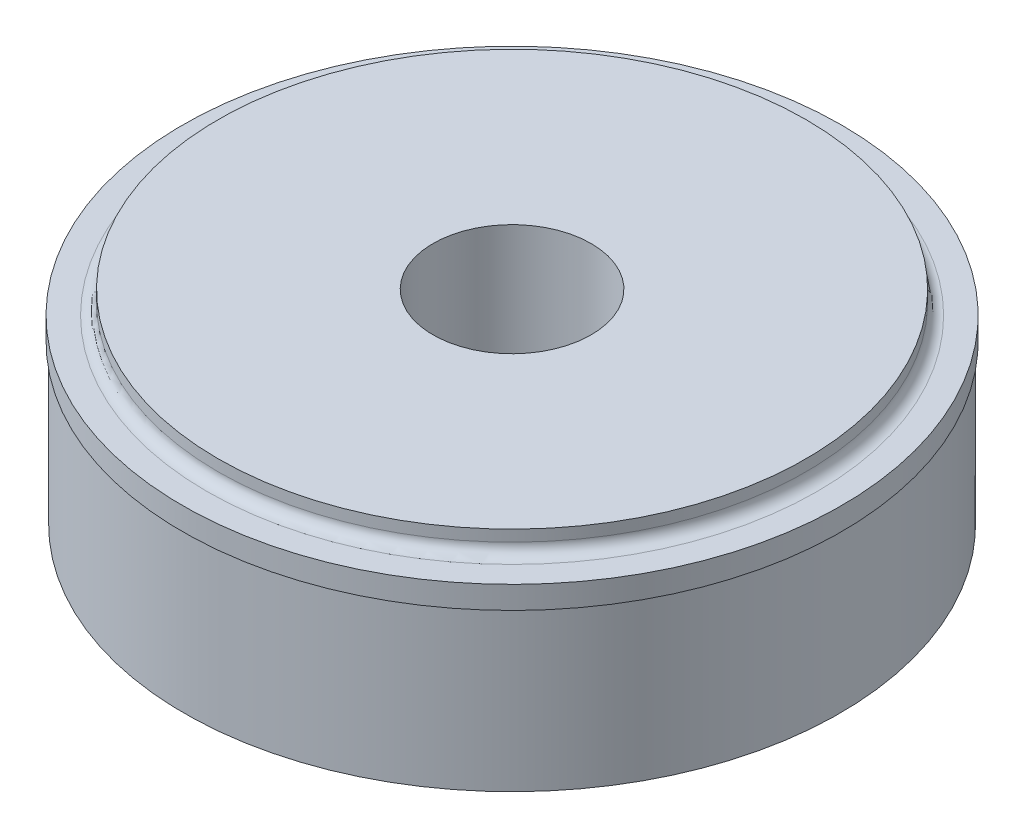
ISO-10303-21;
HEADER;
FILE_DESCRIPTION(('STEP AP214'),'2;1');
FILE_NAME('part.step','',(''),(''),'','','');
FILE_SCHEMA(('AUTOMOTIVE_DESIGN { 1 0 10303 214 1 1 1 1 }'));
ENDSEC;
DATA;
#1=APPLICATION_CONTEXT('core data for automotive mechanical design processes');
#2=APPLICATION_PROTOCOL_DEFINITION('international standard','automotive_design',2000,#1);
#3=PRODUCT_CONTEXT('',#1,'mechanical');
#4=PRODUCT('Part','Part','',(#3));
#5=PRODUCT_RELATED_PRODUCT_CATEGORY('part','',(#4));
#6=PRODUCT_DEFINITION_FORMATION('','',#4);
#7=PRODUCT_DEFINITION_CONTEXT('part definition',#1,'design');
#8=PRODUCT_DEFINITION('design','',#6,#7);
#9=PRODUCT_DEFINITION_SHAPE('','',#8);
#10=(LENGTH_UNIT() NAMED_UNIT(*) SI_UNIT(.MILLI.,.METRE.));
#11=(NAMED_UNIT(*) PLANE_ANGLE_UNIT() SI_UNIT($,.RADIAN.));
#12=(NAMED_UNIT(*) SI_UNIT($,.STERADIAN.) SOLID_ANGLE_UNIT());
#13=UNCERTAINTY_MEASURE_WITH_UNIT(LENGTH_MEASURE(1.E-05),#10,'distance_accuracy_value','');
#14=(GEOMETRIC_REPRESENTATION_CONTEXT(3) GLOBAL_UNCERTAINTY_ASSIGNED_CONTEXT((#13)) GLOBAL_UNIT_ASSIGNED_CONTEXT((#10,
#11,#12)) REPRESENTATION_CONTEXT('',''));
#15=CARTESIAN_POINT('',(0.,0.,0.));
#16=DIRECTION('',(0.,0.,1.));
#17=DIRECTION('',(1.,0.,0.));
#18=AXIS2_PLACEMENT_3D('',#15,#16,#17);
#19=CARTESIAN_POINT('',(0.,45.,65.));
#20=DIRECTION('',(0.,-1.,0.));
#21=DIRECTION('',(0.,0.,-1.));
#22=AXIS2_PLACEMENT_3D('',#19,#20,#21);
#23=PLANE('',#22);
#24=CARTESIAN_POINT('',(0.,45.,0.));
#25=DIRECTION('',(0.,-1.,0.));
#26=DIRECTION('',(0.,0.,-1.));
#27=AXIS2_PLACEMENT_3D('',#24,#25,#26);
#28=CIRCLE('',#27,65.);
#29=CARTESIAN_POINT('',(0.,45.,-65.));
#30=VERTEX_POINT('',#29);
#31=EDGE_CURVE('E10',#30,#30,#28,.T.);
#32=ORIENTED_EDGE('',*,*,#31,.F.);
#33=EDGE_LOOP('',(#32));
#34=FACE_BOUND('',#33,.T.);
#35=CARTESIAN_POINT('',(0.,45.,0.));
#36=DIRECTION('',(0.,-1.,0.));
#37=DIRECTION('',(0.,0.,-1.));
#38=AXIS2_PLACEMENT_3D('',#35,#36,#37);
#39=CIRCLE('',#38,17.5);
#40=CARTESIAN_POINT('',(0.,45.,-17.5));
#41=VERTEX_POINT('',#40);
#42=EDGE_CURVE('E64',#41,#41,#39,.T.);
#43=ORIENTED_EDGE('',*,*,#42,.T.);
#44=EDGE_LOOP('',(#43));
#45=FACE_BOUND('',#44,.T.);
#46=ADVANCED_FACE('F33',(#34,#45),#23,.F.);
#47=CARTESIAN_POINT('',(0.,0.,0.));
#48=DIRECTION('',(0.,-1.,0.));
#49=DIRECTION('',(0.,0.,-1.));
#50=AXIS2_PLACEMENT_3D('',#47,#48,#49);
#51=CYLINDRICAL_SURFACE('',#50,65.);
#52=CARTESIAN_POINT('',(0.,42.5,0.));
#53=DIRECTION('',(0.,-1.,0.));
#54=DIRECTION('',(0.,0.,-1.));
#55=AXIS2_PLACEMENT_3D('',#52,#53,#54);
#56=CIRCLE('',#55,65.);
#57=CARTESIAN_POINT('',(0.,42.5,-65.));
#58=VERTEX_POINT('',#57);
#59=EDGE_CURVE('E39',#58,#58,#56,.T.);
#60=ORIENTED_EDGE('',*,*,#59,.F.);
#61=EDGE_LOOP('',(#60));
#62=FACE_BOUND('',#61,.T.);
#63=ORIENTED_EDGE('',*,*,#31,.T.);
#64=EDGE_LOOP('',(#63));
#65=FACE_BOUND('',#64,.T.);
#66=ADVANCED_FACE('F107',(#62,#65),#51,.T.);
#67=CARTESIAN_POINT('',(0.,42.5,0.));
#68=DIRECTION('',(0.,-1.,0.));
#69=DIRECTION('',(0.,0.,-1.));
#70=AXIS2_PLACEMENT_3D('',#67,#68,#69);
#71=TOROIDAL_SURFACE('',#70,67.5,2.5);
#72=CARTESIAN_POINT('',(0.,40.,0.));
#73=DIRECTION('',(0.,-1.,0.));
#74=DIRECTION('',(0.,0.,-1.));
#75=AXIS2_PLACEMENT_3D('',#72,#73,#74);
#76=CIRCLE('',#75,67.5);
#77=CARTESIAN_POINT('',(0.,40.,-67.5));
#78=VERTEX_POINT('',#77);
#79=EDGE_CURVE('E43',#78,#78,#76,.T.);
#80=ORIENTED_EDGE('',*,*,#79,.F.);
#81=EDGE_LOOP('',(#80));
#82=FACE_BOUND('',#81,.T.);
#83=ORIENTED_EDGE('',*,*,#59,.T.);
#84=EDGE_LOOP('',(#83));
#85=FACE_BOUND('',#84,.T.);
#86=ADVANCED_FACE('F102',(#82,#85),#71,.F.);
#87=CARTESIAN_POINT('',(0.,40.,72.9));
#88=DIRECTION('',(0.,-1.,0.));
#89=DIRECTION('',(0.,0.,-1.));
#90=AXIS2_PLACEMENT_3D('',#87,#88,#89);
#91=PLANE('',#90);
#92=CARTESIAN_POINT('',(0.,40.,0.));
#93=DIRECTION('',(0.,-1.,0.));
#94=DIRECTION('',(0.,0.,-1.));
#95=AXIS2_PLACEMENT_3D('',#92,#93,#94);
#96=CIRCLE('',#95,72.9);
#97=CARTESIAN_POINT('',(0.,40.,-72.9));
#98=VERTEX_POINT('',#97);
#99=EDGE_CURVE('E47',#98,#98,#96,.T.);
#100=ORIENTED_EDGE('',*,*,#99,.F.);
#101=EDGE_LOOP('',(#100));
#102=FACE_BOUND('',#101,.T.);
#103=ORIENTED_EDGE('',*,*,#79,.T.);
#104=EDGE_LOOP('',(#103));
#105=FACE_BOUND('',#104,.T.);
#106=ADVANCED_FACE('F96',(#102,#105),#91,.F.);
#107=CARTESIAN_POINT('',(0.,0.,0.));
#108=DIRECTION('',(0.,-1.,0.));
#109=DIRECTION('',(0.,0.,-1.));
#110=AXIS2_PLACEMENT_3D('',#107,#108,#109);
#111=CYLINDRICAL_SURFACE('',#110,72.9);
#112=CARTESIAN_POINT('',(0.,35.,0.));
#113=DIRECTION('',(0.,-1.,0.));
#114=DIRECTION('',(0.,0.,-1.));
#115=AXIS2_PLACEMENT_3D('',#112,#113,#114);
#116=CIRCLE('',#115,72.9);
#117=CARTESIAN_POINT('',(0.,35.,-72.9));
#118=VERTEX_POINT('',#117);
#119=EDGE_CURVE('E52',#118,#118,#116,.T.);
#120=ORIENTED_EDGE('',*,*,#119,.F.);
#121=EDGE_LOOP('',(#120));
#122=FACE_BOUND('',#121,.T.);
#123=ORIENTED_EDGE('',*,*,#99,.T.);
#124=EDGE_LOOP('',(#123));
#125=FACE_BOUND('',#124,.T.);
#126=ADVANCED_FACE('F90',(#122,#125),#111,.T.);
#127=CARTESIAN_POINT('',(0.,35.,72.5));
#128=DIRECTION('',(0.,1.,0.));
#129=DIRECTION('',(0.,0.,1.));
#130=AXIS2_PLACEMENT_3D('',#127,#128,#129);
#131=PLANE('',#130);
#132=CARTESIAN_POINT('',(0.,35.,0.));
#133=DIRECTION('',(0.,-1.,0.));
#134=DIRECTION('',(0.,0.,-1.));
#135=AXIS2_PLACEMENT_3D('',#132,#133,#134);
#136=CIRCLE('',#135,72.5);
#137=CARTESIAN_POINT('',(0.,35.,-72.5));
#138=VERTEX_POINT('',#137);
#139=EDGE_CURVE('E55',#138,#138,#136,.T.);
#140=ORIENTED_EDGE('',*,*,#139,.F.);
#141=EDGE_LOOP('',(#140));
#142=FACE_BOUND('',#141,.T.);
#143=ORIENTED_EDGE('',*,*,#119,.T.);
#144=EDGE_LOOP('',(#143));
#145=FACE_BOUND('',#144,.T.);
#146=ADVANCED_FACE('F84',(#142,#145),#131,.F.);
#147=CARTESIAN_POINT('',(0.,0.,0.));
#148=DIRECTION('',(0.,-1.,0.));
#149=DIRECTION('',(0.,0.,-1.));
#150=AXIS2_PLACEMENT_3D('',#147,#148,#149);
#151=CYLINDRICAL_SURFACE('',#150,72.5);
#152=CARTESIAN_POINT('',(0.,0.,0.));
#153=DIRECTION('',(0.,-1.,0.));
#154=DIRECTION('',(0.,0.,-1.));
#155=AXIS2_PLACEMENT_3D('',#152,#153,#154);
#156=CIRCLE('',#155,72.5);
#157=CARTESIAN_POINT('',(0.,0.,-72.5));
#158=VERTEX_POINT('',#157);
#159=EDGE_CURVE('E58',#158,#158,#156,.T.);
#160=ORIENTED_EDGE('',*,*,#159,.F.);
#161=EDGE_LOOP('',(#160));
#162=FACE_BOUND('',#161,.T.);
#163=ORIENTED_EDGE('',*,*,#139,.T.);
#164=EDGE_LOOP('',(#163));
#165=FACE_BOUND('',#164,.T.);
#166=ADVANCED_FACE('F78',(#162,#165),#151,.T.);
#167=CARTESIAN_POINT('',(0.,0.,17.5));
#168=DIRECTION('',(0.,1.,0.));
#169=DIRECTION('',(0.,0.,1.));
#170=AXIS2_PLACEMENT_3D('',#167,#168,#169);
#171=PLANE('',#170);
#172=CARTESIAN_POINT('',(0.,0.,0.));
#173=DIRECTION('',(0.,-1.,0.));
#174=DIRECTION('',(0.,0.,-1.));
#175=AXIS2_PLACEMENT_3D('',#172,#173,#174);
#176=CIRCLE('',#175,17.5);
#177=CARTESIAN_POINT('',(0.,0.,-17.5));
#178=VERTEX_POINT('',#177);
#179=EDGE_CURVE('E61',#178,#178,#176,.T.);
#180=ORIENTED_EDGE('',*,*,#179,.F.);
#181=EDGE_LOOP('',(#180));
#182=FACE_BOUND('',#181,.T.);
#183=ORIENTED_EDGE('',*,*,#159,.T.);
#184=EDGE_LOOP('',(#183));
#185=FACE_BOUND('',#184,.T.);
#186=ADVANCED_FACE('F72',(#182,#185),#171,.F.);
#187=CARTESIAN_POINT('',(0.,0.,0.));
#188=DIRECTION('',(0.,-1.,0.));
#189=DIRECTION('',(0.,0.,-1.));
#190=AXIS2_PLACEMENT_3D('',#187,#188,#189);
#191=CYLINDRICAL_SURFACE('',#190,17.5);
#192=ORIENTED_EDGE('',*,*,#42,.F.);
#193=EDGE_LOOP('',(#192));
#194=FACE_BOUND('',#193,.T.);
#195=ORIENTED_EDGE('',*,*,#179,.T.);
#196=EDGE_LOOP('',(#195));
#197=FACE_BOUND('',#196,.T.);
#198=ADVANCED_FACE('F69',(#194,#197),#191,.F.);
#199=CLOSED_SHELL('',(#46,#66,#86,#106,#126,#146,#166,#186,#198));
#200=MANIFOLD_SOLID_BREP('B2',#199);
#201=ADVANCED_BREP_SHAPE_REPRESENTATION('',(#18,#200),#14);
#202=SHAPE_DEFINITION_REPRESENTATION(#9,#201);
ENDSEC;
END-ISO-10303-21;
